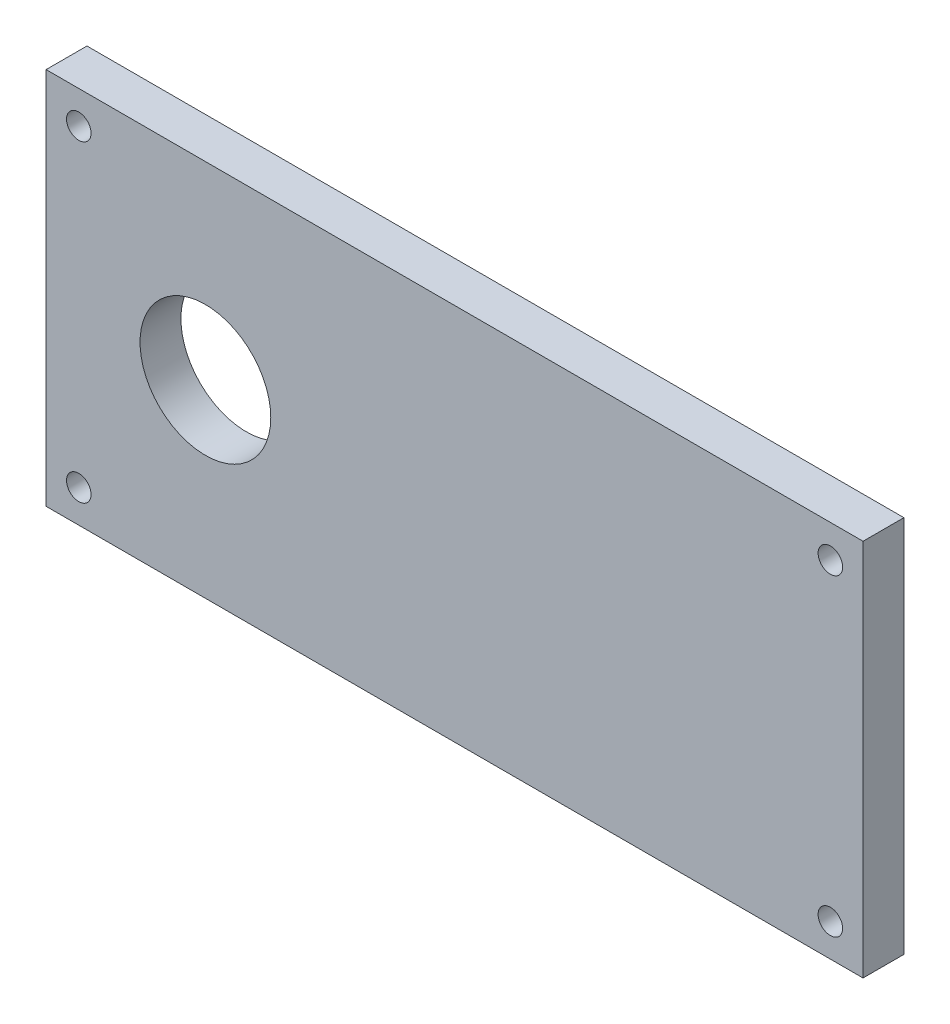
ISO-10303-21;
HEADER;
FILE_DESCRIPTION(('STEP AP214'),'2;1');
FILE_NAME('part.step','',(''),(''),'','','');
FILE_SCHEMA(('AUTOMOTIVE_DESIGN { 1 0 10303 214 1 1 1 1 }'));
ENDSEC;
DATA;
#1=APPLICATION_CONTEXT('core data for automotive mechanical design processes');
#2=APPLICATION_PROTOCOL_DEFINITION('international standard','automotive_design',2000,#1);
#3=PRODUCT_CONTEXT('',#1,'mechanical');
#4=PRODUCT('Part','Part','',(#3));
#5=PRODUCT_RELATED_PRODUCT_CATEGORY('part','',(#4));
#6=PRODUCT_DEFINITION_FORMATION('','',#4);
#7=PRODUCT_DEFINITION_CONTEXT('part definition',#1,'design');
#8=PRODUCT_DEFINITION('design','',#6,#7);
#9=PRODUCT_DEFINITION_SHAPE('','',#8);
#10=(LENGTH_UNIT() NAMED_UNIT(*) SI_UNIT(.MILLI.,.METRE.));
#11=(NAMED_UNIT(*) PLANE_ANGLE_UNIT() SI_UNIT($,.RADIAN.));
#12=(NAMED_UNIT(*) SI_UNIT($,.STERADIAN.) SOLID_ANGLE_UNIT());
#13=UNCERTAINTY_MEASURE_WITH_UNIT(LENGTH_MEASURE(1.E-05),#10,'distance_accuracy_value','');
#14=(GEOMETRIC_REPRESENTATION_CONTEXT(3) GLOBAL_UNCERTAINTY_ASSIGNED_CONTEXT((#13)) GLOBAL_UNIT_ASSIGNED_CONTEXT((#10,
#11,#12)) REPRESENTATION_CONTEXT('',''));
#15=CARTESIAN_POINT('',(0.,0.,0.));
#16=DIRECTION('',(0.,0.,1.));
#17=DIRECTION('',(1.,0.,0.));
#18=AXIS2_PLACEMENT_3D('',#15,#16,#17);
#19=CARTESIAN_POINT('',(0.,0.,5.));
#20=DIRECTION('',(0.,0.,-1.));
#21=DIRECTION('',(-1.,0.,0.));
#22=AXIS2_PLACEMENT_3D('',#19,#20,#21);
#23=PLANE('',#22);
#24=DIRECTION('',(0.,1.,0.));
#25=VECTOR('',#24,1.);
#26=CARTESIAN_POINT('',(50.,-23.15,5.));
#27=LINE('',#26,#25);
#28=CARTESIAN_POINT('',(50.,-23.15,5.));
#29=VERTEX_POINT('',#28);
#30=CARTESIAN_POINT('',(50.,23.15,5.));
#31=VERTEX_POINT('',#30);
#32=EDGE_CURVE('E98',#29,#31,#27,.T.);
#33=ORIENTED_EDGE('',*,*,#32,.T.);
#34=DIRECTION('',(-1.,0.,0.));
#35=VECTOR('',#34,1.);
#36=CARTESIAN_POINT('',(-50.,23.15,5.));
#37=LINE('',#36,#35);
#38=CARTESIAN_POINT('',(-50.,23.15,5.));
#39=VERTEX_POINT('',#38);
#40=EDGE_CURVE('E93',#31,#39,#37,.T.);
#41=ORIENTED_EDGE('',*,*,#40,.T.);
#42=DIRECTION('',(0.,-1.,0.));
#43=VECTOR('',#42,1.);
#44=CARTESIAN_POINT('',(-50.,-23.15,5.));
#45=LINE('',#44,#43);
#46=CARTESIAN_POINT('',(-50.,-23.15,5.));
#47=VERTEX_POINT('',#46);
#48=EDGE_CURVE('E96',#39,#47,#45,.T.);
#49=ORIENTED_EDGE('',*,*,#48,.T.);
#50=DIRECTION('',(1.,0.,0.));
#51=VECTOR('',#50,1.);
#52=CARTESIAN_POINT('',(-50.,-23.15,5.));
#53=LINE('',#52,#51);
#54=EDGE_CURVE('E63',#47,#29,#53,.T.);
#55=ORIENTED_EDGE('',*,*,#54,.T.);
#56=EDGE_LOOP('',(#33,#41,#49,#55));
#57=FACE_BOUND('',#56,.T.);
#58=CARTESIAN_POINT('',(-46.0000000000001,19.1499999999996,5.));
#59=DIRECTION('',(0.,0.,1.));
#60=DIRECTION('',(1.,0.,0.));
#61=AXIS2_PLACEMENT_3D('',#58,#59,#60);
#62=CIRCLE('',#61,1.5);
#63=CARTESIAN_POINT('',(-44.5000000000001,19.1499999999996,5.));
#64=VERTEX_POINT('',#63);
#65=EDGE_CURVE('E120',#64,#64,#62,.T.);
#66=ORIENTED_EDGE('',*,*,#65,.F.);
#67=EDGE_LOOP('',(#66));
#68=FACE_BOUND('',#67,.T.);
#69=CARTESIAN_POINT('',(46.,19.15,5.));
#70=DIRECTION('',(0.,0.,1.));
#71=DIRECTION('',(-1.,0.,0.));
#72=AXIS2_PLACEMENT_3D('',#69,#70,#71);
#73=CIRCLE('',#72,1.5);
#74=CARTESIAN_POINT('',(44.5,19.15,5.));
#75=VERTEX_POINT('',#74);
#76=EDGE_CURVE('E146',#75,#75,#73,.T.);
#77=ORIENTED_EDGE('',*,*,#76,.F.);
#78=EDGE_LOOP('',(#77));
#79=FACE_BOUND('',#78,.T.);
#80=CARTESIAN_POINT('',(46.,-19.15,5.));
#81=DIRECTION('',(0.,0.,1.));
#82=DIRECTION('',(1.,0.,0.));
#83=AXIS2_PLACEMENT_3D('',#80,#81,#82);
#84=CIRCLE('',#83,1.5);
#85=CARTESIAN_POINT('',(47.5,-19.15,5.));
#86=VERTEX_POINT('',#85);
#87=EDGE_CURVE('E154',#86,#86,#84,.T.);
#88=ORIENTED_EDGE('',*,*,#87,.F.);
#89=EDGE_LOOP('',(#88));
#90=FACE_BOUND('',#89,.T.);
#91=CARTESIAN_POINT('',(-46.0000000000001,-19.1499999999996,5.));
#92=DIRECTION('',(0.,0.,1.));
#93=DIRECTION('',(-1.,0.,0.));
#94=AXIS2_PLACEMENT_3D('',#91,#92,#93);
#95=CIRCLE('',#94,1.5);
#96=CARTESIAN_POINT('',(-47.5000000000001,-19.1499999999996,5.));
#97=VERTEX_POINT('',#96);
#98=EDGE_CURVE('E162',#97,#97,#95,.T.);
#99=ORIENTED_EDGE('',*,*,#98,.F.);
#100=EDGE_LOOP('',(#99));
#101=FACE_BOUND('',#100,.T.);
#102=CARTESIAN_POINT('',(-30.5,0.,5.));
#103=DIRECTION('',(0.,0.,1.));
#104=DIRECTION('',(1.,0.,0.));
#105=AXIS2_PLACEMENT_3D('',#102,#103,#104);
#106=CIRCLE('',#105,8.);
#107=CARTESIAN_POINT('',(-22.5,0.,5.));
#108=VERTEX_POINT('',#107);
#109=EDGE_CURVE('E170',#108,#108,#106,.T.);
#110=ORIENTED_EDGE('',*,*,#109,.F.);
#111=EDGE_LOOP('',(#110));
#112=FACE_BOUND('',#111,.T.);
#113=ADVANCED_FACE('F45',(#57,#68,#79,#90,#101,#112),#23,.F.);
#114=CARTESIAN_POINT('',(0.,0.,0.));
#115=DIRECTION('',(0.,0.,-1.));
#116=DIRECTION('',(-1.,0.,0.));
#117=AXIS2_PLACEMENT_3D('',#114,#115,#116);
#118=PLANE('',#117);
#119=CARTESIAN_POINT('',(-46.0000000000001,-19.1499999999996,0.));
#120=DIRECTION('',(0.,0.,1.));
#121=DIRECTION('',(-1.,0.,0.));
#122=AXIS2_PLACEMENT_3D('',#119,#120,#121);
#123=CIRCLE('',#122,1.5);
#124=CARTESIAN_POINT('',(-47.5000000000001,-19.1499999999996,0.));
#125=VERTEX_POINT('',#124);
#126=EDGE_CURVE('E166',#125,#125,#123,.T.);
#127=ORIENTED_EDGE('',*,*,#126,.T.);
#128=EDGE_LOOP('',(#127));
#129=FACE_BOUND('',#128,.T.);
#130=CARTESIAN_POINT('',(46.,19.15,0.));
#131=DIRECTION('',(0.,0.,1.));
#132=DIRECTION('',(-1.,0.,0.));
#133=AXIS2_PLACEMENT_3D('',#130,#131,#132);
#134=CIRCLE('',#133,1.5);
#135=CARTESIAN_POINT('',(44.5,19.15,0.));
#136=VERTEX_POINT('',#135);
#137=EDGE_CURVE('E150',#136,#136,#134,.T.);
#138=ORIENTED_EDGE('',*,*,#137,.T.);
#139=EDGE_LOOP('',(#138));
#140=FACE_BOUND('',#139,.T.);
#141=DIRECTION('',(0.,1.,0.));
#142=VECTOR('',#141,1.);
#143=CARTESIAN_POINT('',(50.,-23.15,0.));
#144=LINE('',#143,#142);
#145=CARTESIAN_POINT('',(50.,-23.15,0.));
#146=VERTEX_POINT('',#145);
#147=CARTESIAN_POINT('',(50.,23.15,0.));
#148=VERTEX_POINT('',#147);
#149=EDGE_CURVE('E116',#146,#148,#144,.T.);
#150=ORIENTED_EDGE('',*,*,#149,.F.);
#151=DIRECTION('',(1.,0.,0.));
#152=VECTOR('',#151,1.);
#153=CARTESIAN_POINT('',(-50.,-23.15,0.));
#154=LINE('',#153,#152);
#155=CARTESIAN_POINT('',(-50.,-23.15,0.));
#156=VERTEX_POINT('',#155);
#157=EDGE_CURVE('E86',#156,#146,#154,.T.);
#158=ORIENTED_EDGE('',*,*,#157,.F.);
#159=DIRECTION('',(0.,-1.,0.));
#160=VECTOR('',#159,1.);
#161=CARTESIAN_POINT('',(-50.,-23.15,0.));
#162=LINE('',#161,#160);
#163=CARTESIAN_POINT('',(-50.,23.15,0.));
#164=VERTEX_POINT('',#163);
#165=EDGE_CURVE('E80',#164,#156,#162,.T.);
#166=ORIENTED_EDGE('',*,*,#165,.F.);
#167=DIRECTION('',(-1.,0.,0.));
#168=VECTOR('',#167,1.);
#169=CARTESIAN_POINT('',(-50.,23.15,0.));
#170=LINE('',#169,#168);
#171=EDGE_CURVE('E103',#148,#164,#170,.T.);
#172=ORIENTED_EDGE('',*,*,#171,.F.);
#173=EDGE_LOOP('',(#150,#158,#166,#172));
#174=FACE_BOUND('',#173,.T.);
#175=CARTESIAN_POINT('',(-46.0000000000001,19.1499999999996,0.));
#176=DIRECTION('',(0.,0.,1.));
#177=DIRECTION('',(1.,0.,0.));
#178=AXIS2_PLACEMENT_3D('',#175,#176,#177);
#179=CIRCLE('',#178,1.5);
#180=CARTESIAN_POINT('',(-44.5000000000001,19.1499999999996,0.));
#181=VERTEX_POINT('',#180);
#182=EDGE_CURVE('E142',#181,#181,#179,.T.);
#183=ORIENTED_EDGE('',*,*,#182,.T.);
#184=EDGE_LOOP('',(#183));
#185=FACE_BOUND('',#184,.T.);
#186=CARTESIAN_POINT('',(46.,-19.15,0.));
#187=DIRECTION('',(0.,0.,1.));
#188=DIRECTION('',(1.,0.,0.));
#189=AXIS2_PLACEMENT_3D('',#186,#187,#188);
#190=CIRCLE('',#189,1.5);
#191=CARTESIAN_POINT('',(47.5,-19.15,0.));
#192=VERTEX_POINT('',#191);
#193=EDGE_CURVE('E158',#192,#192,#190,.T.);
#194=ORIENTED_EDGE('',*,*,#193,.T.);
#195=EDGE_LOOP('',(#194));
#196=FACE_BOUND('',#195,.T.);
#197=CARTESIAN_POINT('',(-30.5,0.,0.));
#198=DIRECTION('',(0.,0.,1.));
#199=DIRECTION('',(1.,0.,0.));
#200=AXIS2_PLACEMENT_3D('',#197,#198,#199);
#201=CIRCLE('',#200,8.);
#202=CARTESIAN_POINT('',(-22.5,0.,0.));
#203=VERTEX_POINT('',#202);
#204=EDGE_CURVE('E174',#203,#203,#201,.T.);
#205=ORIENTED_EDGE('',*,*,#204,.T.);
#206=EDGE_LOOP('',(#205));
#207=FACE_BOUND('',#206,.T.);
#208=ADVANCED_FACE('F135',(#129,#140,#174,#185,#196,#207),#118,.T.);
#209=CARTESIAN_POINT('',(50.,-23.15,5.));
#210=DIRECTION('',(-1.,0.,0.));
#211=DIRECTION('',(0.,0.,1.));
#212=AXIS2_PLACEMENT_3D('',#209,#210,#211);
#213=PLANE('',#212);
#214=ORIENTED_EDGE('',*,*,#149,.T.);
#215=DIRECTION('',(0.,0.,-1.));
#216=VECTOR('',#215,1.);
#217=CARTESIAN_POINT('',(50.,23.15,5.));
#218=LINE('',#217,#216);
#219=EDGE_CURVE('E11',#31,#148,#218,.T.);
#220=ORIENTED_EDGE('',*,*,#219,.F.);
#221=ORIENTED_EDGE('',*,*,#32,.F.);
#222=DIRECTION('',(0.,0.,-1.));
#223=VECTOR('',#222,1.);
#224=CARTESIAN_POINT('',(50.,-23.15,5.));
#225=LINE('',#224,#223);
#226=EDGE_CURVE('E112',#29,#146,#225,.T.);
#227=ORIENTED_EDGE('',*,*,#226,.T.);
#228=EDGE_LOOP('',(#214,#220,#221,#227));
#229=FACE_BOUND('',#228,.T.);
#230=ADVANCED_FACE('F47',(#229),#213,.F.);
#231=CARTESIAN_POINT('',(-50.,23.15,5.));
#232=DIRECTION('',(0.,-1.,0.));
#233=DIRECTION('',(0.,0.,-1.));
#234=AXIS2_PLACEMENT_3D('',#231,#232,#233);
#235=PLANE('',#234);
#236=ORIENTED_EDGE('',*,*,#171,.T.);
#237=DIRECTION('',(0.,0.,-1.));
#238=VECTOR('',#237,1.);
#239=CARTESIAN_POINT('',(-50.,23.15,5.));
#240=LINE('',#239,#238);
#241=EDGE_CURVE('E55',#39,#164,#240,.T.);
#242=ORIENTED_EDGE('',*,*,#241,.F.);
#243=ORIENTED_EDGE('',*,*,#40,.F.);
#244=ORIENTED_EDGE('',*,*,#219,.T.);
#245=EDGE_LOOP('',(#236,#242,#243,#244));
#246=FACE_BOUND('',#245,.T.);
#247=ADVANCED_FACE('F102',(#246),#235,.F.);
#248=CARTESIAN_POINT('',(-50.,-23.15,5.));
#249=DIRECTION('',(1.,0.,0.));
#250=DIRECTION('',(0.,0.,-1.));
#251=AXIS2_PLACEMENT_3D('',#248,#249,#250);
#252=PLANE('',#251);
#253=ORIENTED_EDGE('',*,*,#165,.T.);
#254=DIRECTION('',(0.,0.,-1.));
#255=VECTOR('',#254,1.);
#256=CARTESIAN_POINT('',(-50.,-23.15,5.));
#257=LINE('',#256,#255);
#258=EDGE_CURVE('E105',#47,#156,#257,.T.);
#259=ORIENTED_EDGE('',*,*,#258,.F.);
#260=ORIENTED_EDGE('',*,*,#48,.F.);
#261=ORIENTED_EDGE('',*,*,#241,.T.);
#262=EDGE_LOOP('',(#253,#259,#260,#261));
#263=FACE_BOUND('',#262,.T.);
#264=ADVANCED_FACE('F106',(#263),#252,.F.);
#265=CARTESIAN_POINT('',(-50.,-23.15,5.));
#266=DIRECTION('',(0.,1.,0.));
#267=DIRECTION('',(0.,0.,1.));
#268=AXIS2_PLACEMENT_3D('',#265,#266,#267);
#269=PLANE('',#268);
#270=ORIENTED_EDGE('',*,*,#157,.T.);
#271=ORIENTED_EDGE('',*,*,#226,.F.);
#272=ORIENTED_EDGE('',*,*,#54,.F.);
#273=ORIENTED_EDGE('',*,*,#258,.T.);
#274=EDGE_LOOP('',(#270,#271,#272,#273));
#275=FACE_BOUND('',#274,.T.);
#276=ADVANCED_FACE('F132',(#275),#269,.F.);
#277=CARTESIAN_POINT('',(-46.0000000000001,19.1499999999996,5.));
#278=DIRECTION('',(0.,0.,-1.));
#279=DIRECTION('',(-1.,0.,0.));
#280=AXIS2_PLACEMENT_3D('',#277,#278,#279);
#281=CYLINDRICAL_SURFACE('',#280,1.5);
#282=ORIENTED_EDGE('',*,*,#65,.T.);
#283=EDGE_LOOP('',(#282));
#284=FACE_BOUND('',#283,.T.);
#285=ORIENTED_EDGE('',*,*,#182,.F.);
#286=EDGE_LOOP('',(#285));
#287=FACE_BOUND('',#286,.T.);
#288=ADVANCED_FACE('F195',(#284,#287),#281,.F.);
#289=CARTESIAN_POINT('',(46.,19.15,5.));
#290=DIRECTION('',(0.,0.,-1.));
#291=DIRECTION('',(-1.,0.,0.));
#292=AXIS2_PLACEMENT_3D('',#289,#290,#291);
#293=CYLINDRICAL_SURFACE('',#292,1.5);
#294=ORIENTED_EDGE('',*,*,#76,.T.);
#295=EDGE_LOOP('',(#294));
#296=FACE_BOUND('',#295,.T.);
#297=ORIENTED_EDGE('',*,*,#137,.F.);
#298=EDGE_LOOP('',(#297));
#299=FACE_BOUND('',#298,.T.);
#300=ADVANCED_FACE('F249',(#296,#299),#293,.F.);
#301=CARTESIAN_POINT('',(46.,-19.15,5.));
#302=DIRECTION('',(0.,0.,-1.));
#303=DIRECTION('',(-1.,0.,0.));
#304=AXIS2_PLACEMENT_3D('',#301,#302,#303);
#305=CYLINDRICAL_SURFACE('',#304,1.5);
#306=ORIENTED_EDGE('',*,*,#87,.T.);
#307=EDGE_LOOP('',(#306));
#308=FACE_BOUND('',#307,.T.);
#309=ORIENTED_EDGE('',*,*,#193,.F.);
#310=EDGE_LOOP('',(#309));
#311=FACE_BOUND('',#310,.T.);
#312=ADVANCED_FACE('F258',(#308,#311),#305,.F.);
#313=CARTESIAN_POINT('',(-46.0000000000001,-19.1499999999996,5.));
#314=DIRECTION('',(0.,0.,-1.));
#315=DIRECTION('',(-1.,0.,0.));
#316=AXIS2_PLACEMENT_3D('',#313,#314,#315);
#317=CYLINDRICAL_SURFACE('',#316,1.5);
#318=ORIENTED_EDGE('',*,*,#98,.T.);
#319=EDGE_LOOP('',(#318));
#320=FACE_BOUND('',#319,.T.);
#321=ORIENTED_EDGE('',*,*,#126,.F.);
#322=EDGE_LOOP('',(#321));
#323=FACE_BOUND('',#322,.T.);
#324=ADVANCED_FACE('F267',(#320,#323),#317,.F.);
#325=CARTESIAN_POINT('',(-30.5,0.,5.));
#326=DIRECTION('',(0.,0.,-1.));
#327=DIRECTION('',(-1.,0.,0.));
#328=AXIS2_PLACEMENT_3D('',#325,#326,#327);
#329=CYLINDRICAL_SURFACE('',#328,8.);
#330=ORIENTED_EDGE('',*,*,#109,.T.);
#331=EDGE_LOOP('',(#330));
#332=FACE_BOUND('',#331,.T.);
#333=ORIENTED_EDGE('',*,*,#204,.F.);
#334=EDGE_LOOP('',(#333));
#335=FACE_BOUND('',#334,.T.);
#336=ADVANCED_FACE('F184',(#332,#335),#329,.F.);
#337=CLOSED_SHELL('',(#113,#208,#230,#247,#264,#276,#288,#300,#312,#324,#336));
#338=MANIFOLD_SOLID_BREP('B2',#337);
#339=ADVANCED_BREP_SHAPE_REPRESENTATION('',(#18,#338),#14);
#340=SHAPE_DEFINITION_REPRESENTATION(#9,#339);
ENDSEC;
END-ISO-10303-21;
